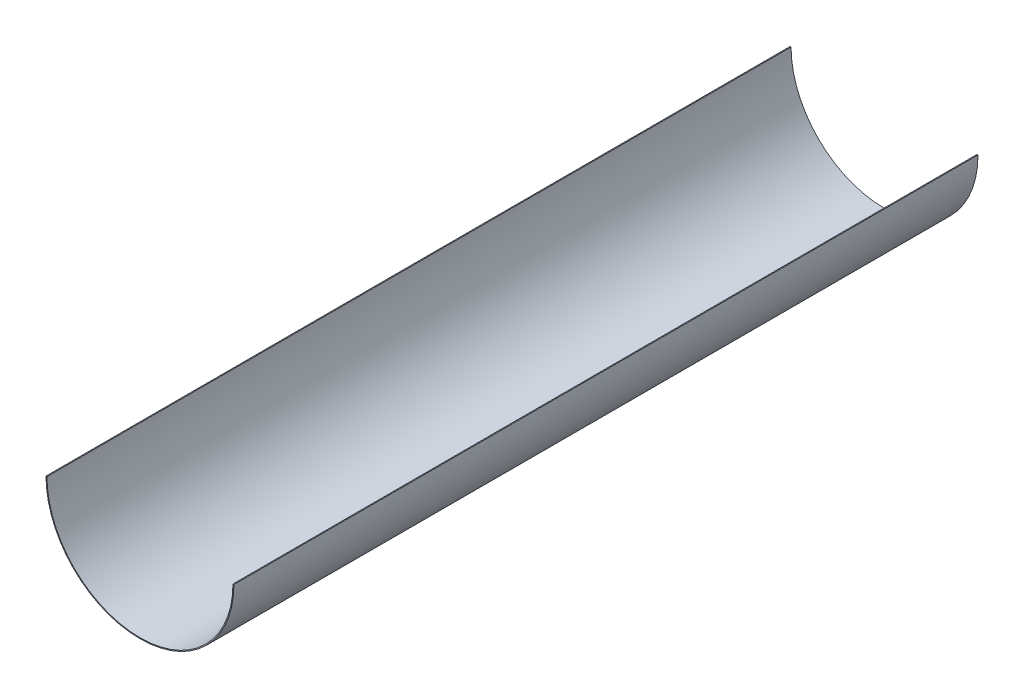
ISO-10303-21;
HEADER;
FILE_DESCRIPTION(('STEP AP214'),'2;1');
FILE_NAME('part.step','',(''),(''),'','','');
FILE_SCHEMA(('AUTOMOTIVE_DESIGN { 1 0 10303 214 1 1 1 1 }'));
ENDSEC;
DATA;
#1=APPLICATION_CONTEXT('core data for automotive mechanical design processes');
#2=APPLICATION_PROTOCOL_DEFINITION('international standard','automotive_design',2000,#1);
#3=PRODUCT_CONTEXT('',#1,'mechanical');
#4=PRODUCT('Part','Part','',(#3));
#5=PRODUCT_RELATED_PRODUCT_CATEGORY('part','',(#4));
#6=PRODUCT_DEFINITION_FORMATION('','',#4);
#7=PRODUCT_DEFINITION_CONTEXT('part definition',#1,'design');
#8=PRODUCT_DEFINITION('design','',#6,#7);
#9=PRODUCT_DEFINITION_SHAPE('','',#8);
#10=(LENGTH_UNIT() NAMED_UNIT(*) SI_UNIT(.MILLI.,.METRE.));
#11=(NAMED_UNIT(*) PLANE_ANGLE_UNIT() SI_UNIT($,.RADIAN.));
#12=(NAMED_UNIT(*) SI_UNIT($,.STERADIAN.) SOLID_ANGLE_UNIT());
#13=UNCERTAINTY_MEASURE_WITH_UNIT(LENGTH_MEASURE(1.E-05),#10,'distance_accuracy_value','');
#14=(GEOMETRIC_REPRESENTATION_CONTEXT(3) GLOBAL_UNCERTAINTY_ASSIGNED_CONTEXT((#13)) GLOBAL_UNIT_ASSIGNED_CONTEXT((#10,
#11,#12)) REPRESENTATION_CONTEXT('',''));
#15=CARTESIAN_POINT('',(0.,0.,0.));
#16=DIRECTION('',(0.,0.,1.));
#17=DIRECTION('',(1.,0.,0.));
#18=AXIS2_PLACEMENT_3D('',#15,#16,#17);
#19=CARTESIAN_POINT('',(0.,0.,8000.));
#20=DIRECTION('',(0.,0.,-1.));
#21=DIRECTION('',(-1.,0.,0.));
#22=AXIS2_PLACEMENT_3D('',#19,#20,#21);
#23=CYLINDRICAL_SURFACE('',#22,1010.);
#24=CARTESIAN_POINT('',(0.,0.,0.));
#25=DIRECTION('',(0.,0.,1.));
#26=DIRECTION('',(1.,0.,0.));
#27=AXIS2_PLACEMENT_3D('',#24,#25,#26);
#28=CIRCLE('',#27,1010.);
#29=CARTESIAN_POINT('',(-1010.,0.,0.));
#30=VERTEX_POINT('',#29);
#31=CARTESIAN_POINT('',(1010.,0.,0.));
#32=VERTEX_POINT('',#31);
#33=EDGE_CURVE('E98',#30,#32,#28,.T.);
#34=ORIENTED_EDGE('',*,*,#33,.T.);
#35=DIRECTION('',(0.,0.,-1.));
#36=VECTOR('',#35,1.);
#37=CARTESIAN_POINT('',(1010.,0.,8000.));
#38=LINE('',#37,#36);
#39=CARTESIAN_POINT('',(1010.,0.,8000.));
#40=VERTEX_POINT('',#39);
#41=EDGE_CURVE('E11',#40,#32,#38,.T.);
#42=ORIENTED_EDGE('',*,*,#41,.F.);
#43=CARTESIAN_POINT('',(0.,0.,8000.));
#44=DIRECTION('',(0.,0.,1.));
#45=DIRECTION('',(1.,0.,0.));
#46=AXIS2_PLACEMENT_3D('',#43,#44,#45);
#47=CIRCLE('',#46,1010.);
#48=CARTESIAN_POINT('',(-1010.,0.,8000.));
#49=VERTEX_POINT('',#48);
#50=EDGE_CURVE('E86',#49,#40,#47,.T.);
#51=ORIENTED_EDGE('',*,*,#50,.F.);
#52=DIRECTION('',(0.,0.,-1.));
#53=VECTOR('',#52,1.);
#54=CARTESIAN_POINT('',(-1010.,0.,8000.));
#55=LINE('',#54,#53);
#56=EDGE_CURVE('E94',#49,#30,#55,.T.);
#57=ORIENTED_EDGE('',*,*,#56,.T.);
#58=EDGE_LOOP('',(#34,#42,#51,#57));
#59=FACE_BOUND('',#58,.T.);
#60=ADVANCED_FACE('F35',(#59),#23,.T.);
#61=CARTESIAN_POINT('',(1000.,0.,8000.));
#62=DIRECTION('',(0.,-1.,0.));
#63=DIRECTION('',(0.,0.,-1.));
#64=AXIS2_PLACEMENT_3D('',#61,#62,#63);
#65=PLANE('',#64);
#66=DIRECTION('',(-1.,0.,0.));
#67=VECTOR('',#66,1.);
#68=CARTESIAN_POINT('',(1000.,0.,0.));
#69=LINE('',#68,#67);
#70=CARTESIAN_POINT('',(1000.,0.,0.));
#71=VERTEX_POINT('',#70);
#72=EDGE_CURVE('E90',#32,#71,#69,.T.);
#73=ORIENTED_EDGE('',*,*,#72,.T.);
#74=DIRECTION('',(0.,0.,-1.));
#75=VECTOR('',#74,1.);
#76=CARTESIAN_POINT('',(1000.,0.,8000.));
#77=LINE('',#76,#75);
#78=CARTESIAN_POINT('',(1000.,0.,8000.));
#79=VERTEX_POINT('',#78);
#80=EDGE_CURVE('E43',#79,#71,#77,.T.);
#81=ORIENTED_EDGE('',*,*,#80,.F.);
#82=DIRECTION('',(-1.,0.,0.));
#83=VECTOR('',#82,1.);
#84=CARTESIAN_POINT('',(1000.,0.,8000.));
#85=LINE('',#84,#83);
#86=EDGE_CURVE('E81',#40,#79,#85,.T.);
#87=ORIENTED_EDGE('',*,*,#86,.F.);
#88=ORIENTED_EDGE('',*,*,#41,.T.);
#89=EDGE_LOOP('',(#73,#81,#87,#88));
#90=FACE_BOUND('',#89,.T.);
#91=ADVANCED_FACE('F89',(#90),#65,.F.);
#92=CARTESIAN_POINT('',(0.,0.,8000.));
#93=DIRECTION('',(0.,0.,-1.));
#94=DIRECTION('',(-1.,0.,0.));
#95=AXIS2_PLACEMENT_3D('',#92,#93,#94);
#96=CYLINDRICAL_SURFACE('',#95,1000.);
#97=CARTESIAN_POINT('',(0.,0.,0.));
#98=DIRECTION('',(0.,0.,-1.));
#99=DIRECTION('',(1.,0.,0.));
#100=AXIS2_PLACEMENT_3D('',#97,#98,#99);
#101=CIRCLE('',#100,1000.);
#102=CARTESIAN_POINT('',(-1000.,0.,0.));
#103=VERTEX_POINT('',#102);
#104=EDGE_CURVE('E68',#71,#103,#101,.T.);
#105=ORIENTED_EDGE('',*,*,#104,.T.);
#106=DIRECTION('',(0.,0.,-1.));
#107=VECTOR('',#106,1.);
#108=CARTESIAN_POINT('',(-1000.,0.,8000.));
#109=LINE('',#108,#107);
#110=CARTESIAN_POINT('',(-1000.,0.,8000.));
#111=VERTEX_POINT('',#110);
#112=EDGE_CURVE('E91',#111,#103,#109,.T.);
#113=ORIENTED_EDGE('',*,*,#112,.F.);
#114=CARTESIAN_POINT('',(0.,0.,8000.));
#115=DIRECTION('',(0.,0.,-1.));
#116=DIRECTION('',(1.,0.,0.));
#117=AXIS2_PLACEMENT_3D('',#114,#115,#116);
#118=CIRCLE('',#117,1000.);
#119=EDGE_CURVE('E84',#79,#111,#118,.T.);
#120=ORIENTED_EDGE('',*,*,#119,.F.);
#121=ORIENTED_EDGE('',*,*,#80,.T.);
#122=EDGE_LOOP('',(#105,#113,#120,#121));
#123=FACE_BOUND('',#122,.T.);
#124=ADVANCED_FACE('F92',(#123),#96,.F.);
#125=CARTESIAN_POINT('',(-1010.,0.,8000.));
#126=DIRECTION('',(0.,-1.,0.));
#127=DIRECTION('',(0.,0.,-1.));
#128=AXIS2_PLACEMENT_3D('',#125,#126,#127);
#129=PLANE('',#128);
#130=DIRECTION('',(-1.,0.,0.));
#131=VECTOR('',#130,1.);
#132=CARTESIAN_POINT('',(-1010.,0.,0.));
#133=LINE('',#132,#131);
#134=EDGE_CURVE('E74',#103,#30,#133,.T.);
#135=ORIENTED_EDGE('',*,*,#134,.T.);
#136=ORIENTED_EDGE('',*,*,#56,.F.);
#137=DIRECTION('',(-1.,0.,0.));
#138=VECTOR('',#137,1.);
#139=CARTESIAN_POINT('',(-1010.,0.,8000.));
#140=LINE('',#139,#138);
#141=EDGE_CURVE('E51',#111,#49,#140,.T.);
#142=ORIENTED_EDGE('',*,*,#141,.F.);
#143=ORIENTED_EDGE('',*,*,#112,.T.);
#144=EDGE_LOOP('',(#135,#136,#142,#143));
#145=FACE_BOUND('',#144,.T.);
#146=ADVANCED_FACE('F105',(#145),#129,.F.);
#147=CARTESIAN_POINT('',(0.,0.,8000.));
#148=DIRECTION('',(0.,0.,1.));
#149=DIRECTION('',(1.,0.,0.));
#150=AXIS2_PLACEMENT_3D('',#147,#148,#149);
#151=PLANE('',#150);
#152=ORIENTED_EDGE('',*,*,#50,.T.);
#153=ORIENTED_EDGE('',*,*,#86,.T.);
#154=ORIENTED_EDGE('',*,*,#119,.T.);
#155=ORIENTED_EDGE('',*,*,#141,.T.);
#156=EDGE_LOOP('',(#152,#153,#154,#155));
#157=FACE_BOUND('',#156,.T.);
#158=ADVANCED_FACE('F82',(#157),#151,.T.);
#159=CARTESIAN_POINT('',(0.,0.,0.));
#160=DIRECTION('',(0.,0.,1.));
#161=DIRECTION('',(1.,0.,0.));
#162=AXIS2_PLACEMENT_3D('',#159,#160,#161);
#163=PLANE('',#162);
#164=ORIENTED_EDGE('',*,*,#33,.F.);
#165=ORIENTED_EDGE('',*,*,#134,.F.);
#166=ORIENTED_EDGE('',*,*,#104,.F.);
#167=ORIENTED_EDGE('',*,*,#72,.F.);
#168=EDGE_LOOP('',(#164,#165,#166,#167));
#169=FACE_BOUND('',#168,.T.);
#170=ADVANCED_FACE('F108',(#169),#163,.F.);
#171=CLOSED_SHELL('',(#60,#91,#124,#146,#158,#170));
#172=MANIFOLD_SOLID_BREP('B2',#171);
#173=ADVANCED_BREP_SHAPE_REPRESENTATION('',(#18,#172),#14);
#174=SHAPE_DEFINITION_REPRESENTATION(#9,#173);
ENDSEC;
END-ISO-10303-21;
